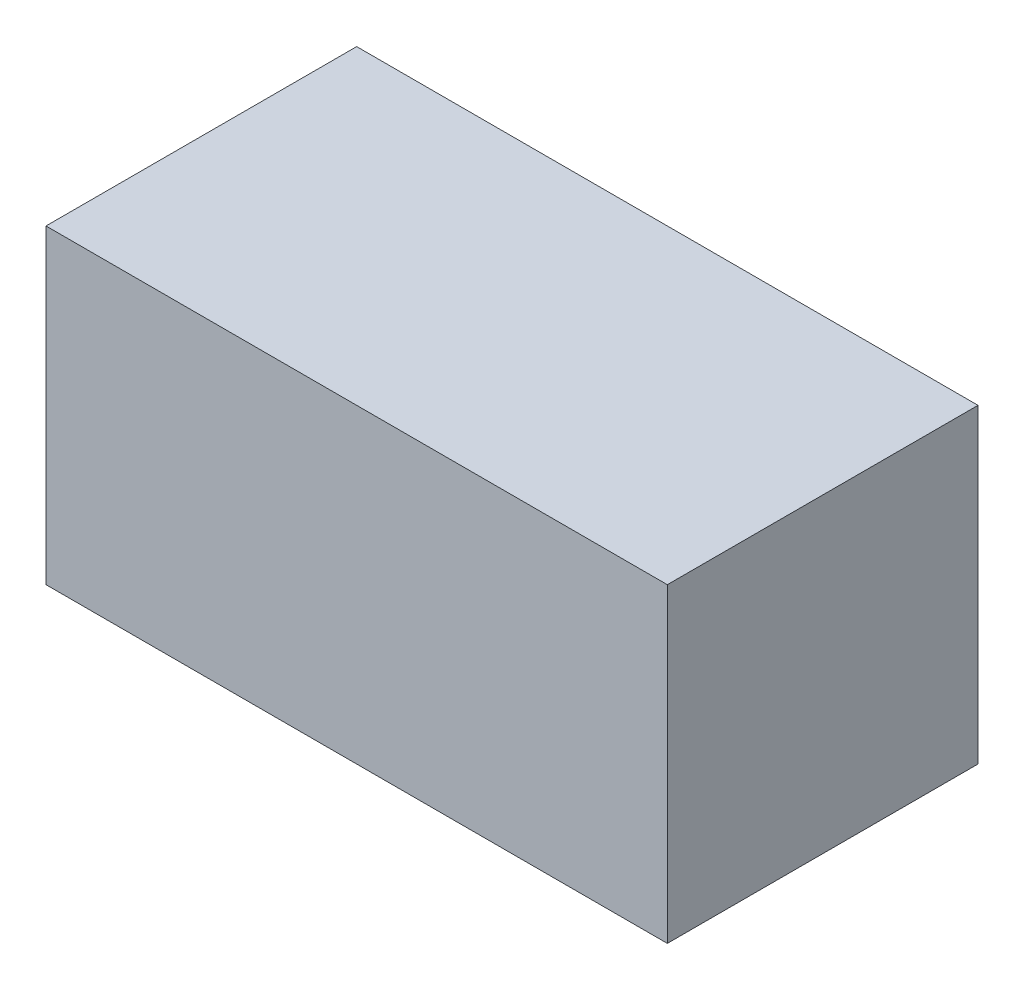
ISO-10303-21;
HEADER;
FILE_DESCRIPTION(('STEP AP214'),'2;1');
FILE_NAME('part.step','',(''),(''),'','','');
FILE_SCHEMA(('AUTOMOTIVE_DESIGN { 1 0 10303 214 1 1 1 1 }'));
ENDSEC;
DATA;
#1=APPLICATION_CONTEXT('core data for automotive mechanical design processes');
#2=APPLICATION_PROTOCOL_DEFINITION('international standard','automotive_design',2000,#1);
#3=PRODUCT_CONTEXT('',#1,'mechanical');
#4=PRODUCT('Part','Part','',(#3));
#5=PRODUCT_RELATED_PRODUCT_CATEGORY('part','',(#4));
#6=PRODUCT_DEFINITION_FORMATION('','',#4);
#7=PRODUCT_DEFINITION_CONTEXT('part definition',#1,'design');
#8=PRODUCT_DEFINITION('design','',#6,#7);
#9=PRODUCT_DEFINITION_SHAPE('','',#8);
#10=(LENGTH_UNIT() NAMED_UNIT(*) SI_UNIT(.MILLI.,.METRE.));
#11=(NAMED_UNIT(*) PLANE_ANGLE_UNIT() SI_UNIT($,.RADIAN.));
#12=(NAMED_UNIT(*) SI_UNIT($,.STERADIAN.) SOLID_ANGLE_UNIT());
#13=UNCERTAINTY_MEASURE_WITH_UNIT(LENGTH_MEASURE(1.E-05),#10,'distance_accuracy_value','');
#14=(GEOMETRIC_REPRESENTATION_CONTEXT(3) GLOBAL_UNCERTAINTY_ASSIGNED_CONTEXT((#13)) GLOBAL_UNIT_ASSIGNED_CONTEXT((#10,
#11,#12)) REPRESENTATION_CONTEXT('',''));
#15=CARTESIAN_POINT('',(0.,0.,0.));
#16=DIRECTION('',(0.,0.,1.));
#17=DIRECTION('',(1.,0.,0.));
#18=AXIS2_PLACEMENT_3D('',#15,#16,#17);
#19=CARTESIAN_POINT('',(0.,152.4,0.));
#20=DIRECTION('',(-1.,0.,0.));
#21=DIRECTION('',(0.,0.,1.));
#22=AXIS2_PLACEMENT_3D('',#19,#20,#21);
#23=PLANE('',#22);
#24=DIRECTION('',(0.,0.,-1.));
#25=VECTOR('',#24,1.);
#26=CARTESIAN_POINT('',(0.,0.,0.));
#27=LINE('',#26,#25);
#28=CARTESIAN_POINT('',(0.,0.,0.));
#29=VERTEX_POINT('',#28);
#30=CARTESIAN_POINT('',(0.,0.,-152.4));
#31=VERTEX_POINT('',#30);
#32=EDGE_CURVE('E96',#29,#31,#27,.T.);
#33=ORIENTED_EDGE('',*,*,#32,.T.);
#34=DIRECTION('',(0.,-1.,0.));
#35=VECTOR('',#34,1.);
#36=CARTESIAN_POINT('',(0.,152.4,-152.4));
#37=LINE('',#36,#35);
#38=CARTESIAN_POINT('',(0.,152.4,-152.4));
#39=VERTEX_POINT('',#38);
#40=EDGE_CURVE('E11',#39,#31,#37,.T.);
#41=ORIENTED_EDGE('',*,*,#40,.F.);
#42=DIRECTION('',(0.,0.,-1.));
#43=VECTOR('',#42,1.);
#44=CARTESIAN_POINT('',(0.,152.4,0.));
#45=LINE('',#44,#43);
#46=CARTESIAN_POINT('',(0.,152.4,0.));
#47=VERTEX_POINT('',#46);
#48=EDGE_CURVE('E84',#47,#39,#45,.T.);
#49=ORIENTED_EDGE('',*,*,#48,.F.);
#50=DIRECTION('',(0.,-1.,0.));
#51=VECTOR('',#50,1.);
#52=CARTESIAN_POINT('',(0.,152.4,0.));
#53=LINE('',#52,#51);
#54=EDGE_CURVE('E92',#47,#29,#53,.T.);
#55=ORIENTED_EDGE('',*,*,#54,.T.);
#56=EDGE_LOOP('',(#33,#41,#49,#55));
#57=FACE_BOUND('',#56,.T.);
#58=ADVANCED_FACE('F33',(#57),#23,.F.);
#59=CARTESIAN_POINT('',(0.,152.4,-152.4));
#60=DIRECTION('',(0.,0.,1.));
#61=DIRECTION('',(1.,0.,0.));
#62=AXIS2_PLACEMENT_3D('',#59,#60,#61);
#63=PLANE('',#62);
#64=DIRECTION('',(-1.,0.,0.));
#65=VECTOR('',#64,1.);
#66=CARTESIAN_POINT('',(0.,0.,-152.4));
#67=LINE('',#66,#65);
#68=CARTESIAN_POINT('',(-304.8,0.,-152.4));
#69=VERTEX_POINT('',#68);
#70=EDGE_CURVE('E88',#31,#69,#67,.T.);
#71=ORIENTED_EDGE('',*,*,#70,.T.);
#72=DIRECTION('',(0.,-1.,0.));
#73=VECTOR('',#72,1.);
#74=CARTESIAN_POINT('',(-304.8,152.4,-152.4));
#75=LINE('',#74,#73);
#76=CARTESIAN_POINT('',(-304.8,152.4,-152.4));
#77=VERTEX_POINT('',#76);
#78=EDGE_CURVE('E41',#77,#69,#75,.T.);
#79=ORIENTED_EDGE('',*,*,#78,.F.);
#80=DIRECTION('',(-1.,0.,0.));
#81=VECTOR('',#80,1.);
#82=CARTESIAN_POINT('',(0.,152.4,-152.4));
#83=LINE('',#82,#81);
#84=EDGE_CURVE('E79',#39,#77,#83,.T.);
#85=ORIENTED_EDGE('',*,*,#84,.F.);
#86=ORIENTED_EDGE('',*,*,#40,.T.);
#87=EDGE_LOOP('',(#71,#79,#85,#86));
#88=FACE_BOUND('',#87,.T.);
#89=ADVANCED_FACE('F87',(#88),#63,.F.);
#90=CARTESIAN_POINT('',(-304.8,152.4,0.));
#91=DIRECTION('',(1.,0.,0.));
#92=DIRECTION('',(0.,0.,-1.));
#93=AXIS2_PLACEMENT_3D('',#90,#91,#92);
#94=PLANE('',#93);
#95=DIRECTION('',(0.,0.,1.));
#96=VECTOR('',#95,1.);
#97=CARTESIAN_POINT('',(-304.8,0.,0.));
#98=LINE('',#97,#96);
#99=CARTESIAN_POINT('',(-304.8,0.,0.));
#100=VERTEX_POINT('',#99);
#101=EDGE_CURVE('E66',#69,#100,#98,.T.);
#102=ORIENTED_EDGE('',*,*,#101,.T.);
#103=DIRECTION('',(0.,-1.,0.));
#104=VECTOR('',#103,1.);
#105=CARTESIAN_POINT('',(-304.8,152.4,0.));
#106=LINE('',#105,#104);
#107=CARTESIAN_POINT('',(-304.8,152.4,0.));
#108=VERTEX_POINT('',#107);
#109=EDGE_CURVE('E89',#108,#100,#106,.T.);
#110=ORIENTED_EDGE('',*,*,#109,.F.);
#111=DIRECTION('',(0.,0.,1.));
#112=VECTOR('',#111,1.);
#113=CARTESIAN_POINT('',(-304.8,152.4,0.));
#114=LINE('',#113,#112);
#115=EDGE_CURVE('E82',#77,#108,#114,.T.);
#116=ORIENTED_EDGE('',*,*,#115,.F.);
#117=ORIENTED_EDGE('',*,*,#78,.T.);
#118=EDGE_LOOP('',(#102,#110,#116,#117));
#119=FACE_BOUND('',#118,.T.);
#120=ADVANCED_FACE('F90',(#119),#94,.F.);
#121=CARTESIAN_POINT('',(0.,152.4,0.));
#122=DIRECTION('',(0.,0.,-1.));
#123=DIRECTION('',(-1.,0.,0.));
#124=AXIS2_PLACEMENT_3D('',#121,#122,#123);
#125=PLANE('',#124);
#126=DIRECTION('',(1.,0.,0.));
#127=VECTOR('',#126,1.);
#128=CARTESIAN_POINT('',(0.,0.,0.));
#129=LINE('',#128,#127);
#130=EDGE_CURVE('E72',#100,#29,#129,.T.);
#131=ORIENTED_EDGE('',*,*,#130,.T.);
#132=ORIENTED_EDGE('',*,*,#54,.F.);
#133=DIRECTION('',(1.,0.,0.));
#134=VECTOR('',#133,1.);
#135=CARTESIAN_POINT('',(0.,152.4,0.));
#136=LINE('',#135,#134);
#137=EDGE_CURVE('E49',#108,#47,#136,.T.);
#138=ORIENTED_EDGE('',*,*,#137,.F.);
#139=ORIENTED_EDGE('',*,*,#109,.T.);
#140=EDGE_LOOP('',(#131,#132,#138,#139));
#141=FACE_BOUND('',#140,.T.);
#142=ADVANCED_FACE('F103',(#141),#125,.F.);
#143=CARTESIAN_POINT('',(0.,152.4,0.));
#144=DIRECTION('',(0.,1.,0.));
#145=DIRECTION('',(0.,0.,1.));
#146=AXIS2_PLACEMENT_3D('',#143,#144,#145);
#147=PLANE('',#146);
#148=ORIENTED_EDGE('',*,*,#48,.T.);
#149=ORIENTED_EDGE('',*,*,#84,.T.);
#150=ORIENTED_EDGE('',*,*,#115,.T.);
#151=ORIENTED_EDGE('',*,*,#137,.T.);
#152=EDGE_LOOP('',(#148,#149,#150,#151));
#153=FACE_BOUND('',#152,.T.);
#154=ADVANCED_FACE('F80',(#153),#147,.T.);
#155=CARTESIAN_POINT('',(0.,0.,0.));
#156=DIRECTION('',(0.,1.,0.));
#157=DIRECTION('',(0.,0.,1.));
#158=AXIS2_PLACEMENT_3D('',#155,#156,#157);
#159=PLANE('',#158);
#160=ORIENTED_EDGE('',*,*,#32,.F.);
#161=ORIENTED_EDGE('',*,*,#130,.F.);
#162=ORIENTED_EDGE('',*,*,#101,.F.);
#163=ORIENTED_EDGE('',*,*,#70,.F.);
#164=EDGE_LOOP('',(#160,#161,#162,#163));
#165=FACE_BOUND('',#164,.T.);
#166=ADVANCED_FACE('F106',(#165),#159,.F.);
#167=CLOSED_SHELL('',(#58,#89,#120,#142,#154,#166));
#168=MANIFOLD_SOLID_BREP('B2',#167);
#169=ADVANCED_BREP_SHAPE_REPRESENTATION('',(#18,#168),#14);
#170=SHAPE_DEFINITION_REPRESENTATION(#9,#169);
ENDSEC;
END-ISO-10303-21;
